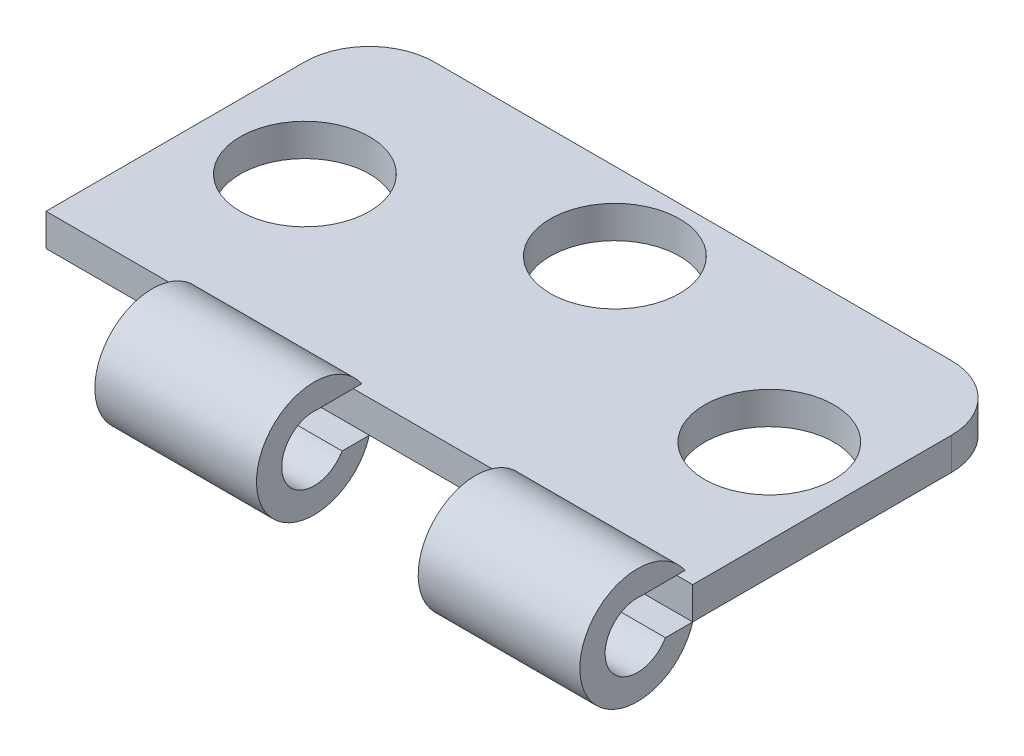
ISO-10303-21;
HEADER;
FILE_DESCRIPTION(('STEP AP214'),'2;1');
FILE_NAME('part.step','',(''),(''),'','','');
FILE_SCHEMA(('AUTOMOTIVE_DESIGN { 1 0 10303 214 1 1 1 1 }'));
ENDSEC;
DATA;
#1=APPLICATION_CONTEXT('core data for automotive mechanical design processes');
#2=APPLICATION_PROTOCOL_DEFINITION('international standard','automotive_design',2000,#1);
#3=PRODUCT_CONTEXT('',#1,'mechanical');
#4=PRODUCT('Part','Part','',(#3));
#5=PRODUCT_RELATED_PRODUCT_CATEGORY('part','',(#4));
#6=PRODUCT_DEFINITION_FORMATION('','',#4);
#7=PRODUCT_DEFINITION_CONTEXT('part definition',#1,'design');
#8=PRODUCT_DEFINITION('design','',#6,#7);
#9=PRODUCT_DEFINITION_SHAPE('','',#8);
#10=(LENGTH_UNIT() NAMED_UNIT(*) SI_UNIT(.MILLI.,.METRE.));
#11=(NAMED_UNIT(*) PLANE_ANGLE_UNIT() SI_UNIT($,.RADIAN.));
#12=(NAMED_UNIT(*) SI_UNIT($,.STERADIAN.) SOLID_ANGLE_UNIT());
#13=UNCERTAINTY_MEASURE_WITH_UNIT(LENGTH_MEASURE(1.E-05),#10,'distance_accuracy_value','');
#14=(GEOMETRIC_REPRESENTATION_CONTEXT(3) GLOBAL_UNCERTAINTY_ASSIGNED_CONTEXT((#13)) GLOBAL_UNIT_ASSIGNED_CONTEXT((#10,
#11,#12)) REPRESENTATION_CONTEXT('',''));
#15=CARTESIAN_POINT('',(0.,0.,0.));
#16=DIRECTION('',(0.,0.,1.));
#17=DIRECTION('',(1.,0.,0.));
#18=AXIS2_PLACEMENT_3D('',#15,#16,#17);
#19=CARTESIAN_POINT('',(-50.,15.2059594320731,0.0627148784948373));
#20=DIRECTION('',(0.,0.999991494928301,0.00412432674047643));
#21=DIRECTION('',(0.,-0.00412432674047643,0.999991494928301));
#22=AXIS2_PLACEMENT_3D('',#19,#20,#21);
#23=PLANE('',#22);
#24=DIRECTION('',(0.,-0.00412432674047643,0.999991494928301));
#25=VECTOR('',#24,1.);
#26=CARTESIAN_POINT('',(0.,15.2059594320731,0.0627148784948373));
#27=LINE('',#26,#25);
#28=CARTESIAN_POINT('',(0.,14.9903091140436,52.3496692052959));
#29=VERTEX_POINT('',#28);
#30=CARTESIAN_POINT('',(0.,14.9342237355402,65.9482284423281));
#31=VERTEX_POINT('',#30);
#32=EDGE_CURVE('E116',#29,#31,#27,.T.);
#33=ORIENTED_EDGE('',*,*,#32,.T.);
#34=DIRECTION('',(1.,0.,0.));
#35=VECTOR('',#34,1.);
#36=CARTESIAN_POINT('',(-50.,14.9342237355402,65.9482284423281));
#37=LINE('',#36,#35);
#38=CARTESIAN_POINT('',(-50.,14.9342237355402,65.9482284423281));
#39=VERTEX_POINT('',#38);
#40=EDGE_CURVE('E12',#39,#31,#37,.T.);
#41=ORIENTED_EDGE('',*,*,#40,.F.);
#42=DIRECTION('',(0.,-0.00412432674047643,0.999991494928301));
#43=VECTOR('',#42,1.);
#44=CARTESIAN_POINT('',(-50.,15.2059594320731,0.0627148784948373));
#45=LINE('',#44,#43);
#46=CARTESIAN_POINT('',(-50.,14.9903091140436,52.3496692052959));
#47=VERTEX_POINT('',#46);
#48=EDGE_CURVE('E111',#47,#39,#45,.T.);
#49=ORIENTED_EDGE('',*,*,#48,.F.);
#50=DIRECTION('',(1.,0.,0.));
#51=VECTOR('',#50,1.);
#52=CARTESIAN_POINT('',(-50.,14.9903091140436,52.3496692052959));
#53=LINE('',#52,#51);
#54=EDGE_CURVE('E55',#47,#29,#53,.T.);
#55=ORIENTED_EDGE('',*,*,#54,.T.);
#56=EDGE_LOOP('',(#33,#41,#49,#55));
#57=FACE_BOUND('',#56,.T.);
#58=ADVANCED_FACE('F52',(#57),#23,.F.);
#59=CARTESIAN_POINT('',(-50.,5.,67.0933043228832));
#60=DIRECTION('',(1.,0.,0.));
#61=DIRECTION('',(0.,0.,-1.));
#62=AXIS2_PLACEMENT_3D('',#59,#60,#61);
#63=CYLINDRICAL_SURFACE('',#62,10.);
#64=CARTESIAN_POINT('',(0.,5.,67.0933043228832));
#65=DIRECTION('',(1.,0.,0.));
#66=DIRECTION('',(0.,0.,-1.));
#67=AXIS2_PLACEMENT_3D('',#64,#65,#66);
#68=CIRCLE('',#67,10.);
#69=CARTESIAN_POINT('',(0.,0.,58.4330502850388));
#70=VERTEX_POINT('',#69);
#71=EDGE_CURVE('E91',#31,#70,#68,.T.);
#72=ORIENTED_EDGE('',*,*,#71,.T.);
#73=DIRECTION('',(1.,0.,0.));
#74=VECTOR('',#73,1.);
#75=CARTESIAN_POINT('',(-50.,0.,58.4330502850388));
#76=LINE('',#75,#74);
#77=CARTESIAN_POINT('',(-50.,0.,58.4330502850388));
#78=VERTEX_POINT('',#77);
#79=EDGE_CURVE('E61',#78,#70,#76,.T.);
#80=ORIENTED_EDGE('',*,*,#79,.F.);
#81=CARTESIAN_POINT('',(-50.,5.,67.0933043228832));
#82=DIRECTION('',(1.,0.,0.));
#83=DIRECTION('',(0.,0.,-1.));
#84=AXIS2_PLACEMENT_3D('',#81,#82,#83);
#85=CIRCLE('',#84,10.);
#86=EDGE_CURVE('E69',#39,#78,#85,.T.);
#87=ORIENTED_EDGE('',*,*,#86,.F.);
#88=ORIENTED_EDGE('',*,*,#40,.T.);
#89=EDGE_LOOP('',(#72,#80,#87,#88));
#90=FACE_BOUND('',#89,.T.);
#91=ADVANCED_FACE('F123',(#90),#63,.F.);
#92=CARTESIAN_POINT('',(-50.,0.,0.));
#93=DIRECTION('',(0.,1.,0.));
#94=DIRECTION('',(0.,0.,1.));
#95=AXIS2_PLACEMENT_3D('',#92,#93,#94);
#96=PLANE('',#95);
#97=DIRECTION('',(0.,0.,1.));
#98=VECTOR('',#97,1.);
#99=CARTESIAN_POINT('',(0.,0.,0.));
#100=LINE('',#99,#98);
#101=CARTESIAN_POINT('',(0.,0.,50.));
#102=VERTEX_POINT('',#101);
#103=EDGE_CURVE('E103',#102,#70,#100,.T.);
#104=ORIENTED_EDGE('',*,*,#103,.F.);
#105=DIRECTION('',(1.,0.,0.));
#106=VECTOR('',#105,1.);
#107=CARTESIAN_POINT('',(-50.,0.,50.));
#108=LINE('',#107,#106);
#109=CARTESIAN_POINT('',(-50.,0.,50.));
#110=VERTEX_POINT('',#109);
#111=EDGE_CURVE('E99',#110,#102,#108,.T.);
#112=ORIENTED_EDGE('',*,*,#111,.F.);
#113=DIRECTION('',(0.,0.,1.));
#114=VECTOR('',#113,1.);
#115=CARTESIAN_POINT('',(-50.,0.,0.));
#116=LINE('',#115,#114);
#117=EDGE_CURVE('E102',#110,#78,#116,.T.);
#118=ORIENTED_EDGE('',*,*,#117,.T.);
#119=ORIENTED_EDGE('',*,*,#79,.T.);
#120=EDGE_LOOP('',(#104,#112,#118,#119));
#121=FACE_BOUND('',#120,.T.);
#122=ADVANCED_FACE('F101',(#121),#96,.T.);
#123=CARTESIAN_POINT('',(-50.,5.,67.0933043228832));
#124=DIRECTION('',(1.,0.,0.));
#125=DIRECTION('',(0.,0.,-1.));
#126=AXIS2_PLACEMENT_3D('',#123,#124,#125);
#127=CYLINDRICAL_SURFACE('',#126,17.8095775546389);
#128=CARTESIAN_POINT('',(0.,5.,67.0933043228832));
#129=DIRECTION('',(1.,0.,0.));
#130=DIRECTION('',(0.,0.,-1.));
#131=AXIS2_PLACEMENT_3D('',#128,#129,#130);
#132=CIRCLE('',#131,17.8095775546389);
#133=EDGE_CURVE('E119',#29,#102,#132,.T.);
#134=ORIENTED_EDGE('',*,*,#133,.F.);
#135=ORIENTED_EDGE('',*,*,#54,.F.);
#136=CARTESIAN_POINT('',(-50.,5.,67.0933043228832));
#137=DIRECTION('',(1.,0.,0.));
#138=DIRECTION('',(0.,0.,-1.));
#139=AXIS2_PLACEMENT_3D('',#136,#137,#138);
#140=CIRCLE('',#139,17.8095775546389);
#141=EDGE_CURVE('E108',#47,#110,#140,.T.);
#142=ORIENTED_EDGE('',*,*,#141,.T.);
#143=ORIENTED_EDGE('',*,*,#111,.T.);
#144=EDGE_LOOP('',(#134,#135,#142,#143));
#145=FACE_BOUND('',#144,.T.);
#146=ADVANCED_FACE('F110',(#145),#127,.T.);
#147=CARTESIAN_POINT('',(-50.,0.,0.));
#148=DIRECTION('',(1.,0.,0.));
#149=DIRECTION('',(0.,0.,-1.));
#150=AXIS2_PLACEMENT_3D('',#147,#148,#149);
#151=PLANE('',#150);
#152=ORIENTED_EDGE('',*,*,#48,.T.);
#153=ORIENTED_EDGE('',*,*,#86,.T.);
#154=ORIENTED_EDGE('',*,*,#117,.F.);
#155=ORIENTED_EDGE('',*,*,#141,.F.);
#156=EDGE_LOOP('',(#152,#153,#154,#155));
#157=FACE_BOUND('',#156,.T.);
#158=ADVANCED_FACE('F107',(#157),#151,.F.);
#159=CARTESIAN_POINT('',(0.,0.,0.));
#160=DIRECTION('',(1.,0.,0.));
#161=DIRECTION('',(0.,0.,-1.));
#162=AXIS2_PLACEMENT_3D('',#159,#160,#161);
#163=PLANE('',#162);
#164=ORIENTED_EDGE('',*,*,#32,.F.);
#165=ORIENTED_EDGE('',*,*,#133,.T.);
#166=ORIENTED_EDGE('',*,*,#103,.T.);
#167=ORIENTED_EDGE('',*,*,#71,.F.);
#168=EDGE_LOOP('',(#164,#165,#166,#167));
#169=FACE_BOUND('',#168,.T.);
#170=ADVANCED_FACE('F125',(#169),#163,.T.);
#171=CLOSED_SHELL('',(#58,#91,#122,#146,#158,#170));
#172=MANIFOLD_SOLID_BREP('B2',#171);
#173=CARTESIAN_POINT('',(50.,15.2059594320731,0.0627148784948373));
#174=DIRECTION('',(0.,0.999991494928301,0.00412432674047643));
#175=DIRECTION('',(0.,-0.00412432674047643,0.999991494928301));
#176=AXIS2_PLACEMENT_3D('',#173,#174,#175);
#177=PLANE('',#176);
#178=DIRECTION('',(0.,-0.00412432674047643,0.999991494928301));
#179=VECTOR('',#178,1.);
#180=CARTESIAN_POINT('',(100.,15.2059594320731,0.0627148784948373));
#181=LINE('',#180,#179);
#182=CARTESIAN_POINT('',(100.,14.9903091140436,52.3496692052959));
#183=VERTEX_POINT('',#182);
#184=CARTESIAN_POINT('',(100.,14.9342237355402,65.9482284423281));
#185=VERTEX_POINT('',#184);
#186=EDGE_CURVE('E249',#183,#185,#181,.T.);
#187=ORIENTED_EDGE('',*,*,#186,.T.);
#188=DIRECTION('',(1.,0.,0.));
#189=VECTOR('',#188,1.);
#190=CARTESIAN_POINT('',(50.,14.9342237355402,65.9482284423281));
#191=LINE('',#190,#189);
#192=CARTESIAN_POINT('',(50.,14.9342237355402,65.9482284423281));
#193=VERTEX_POINT('',#192);
#194=EDGE_CURVE('E50',#193,#185,#191,.T.);
#195=ORIENTED_EDGE('',*,*,#194,.F.);
#196=DIRECTION('',(0.,-0.00412432674047643,0.999991494928301));
#197=VECTOR('',#196,1.);
#198=CARTESIAN_POINT('',(50.,15.2059594320731,0.0627148784948373));
#199=LINE('',#198,#197);
#200=CARTESIAN_POINT('',(50.,14.9903091140436,52.3496692052959));
#201=VERTEX_POINT('',#200);
#202=EDGE_CURVE('E244',#201,#193,#199,.T.);
#203=ORIENTED_EDGE('',*,*,#202,.F.);
#204=DIRECTION('',(1.,0.,0.));
#205=VECTOR('',#204,1.);
#206=CARTESIAN_POINT('',(50.,14.9903091140436,52.3496692052959));
#207=LINE('',#206,#205);
#208=EDGE_CURVE('E188',#201,#183,#207,.T.);
#209=ORIENTED_EDGE('',*,*,#208,.T.);
#210=EDGE_LOOP('',(#187,#195,#203,#209));
#211=FACE_BOUND('',#210,.T.);
#212=ADVANCED_FACE('F185',(#211),#177,.F.);
#213=CARTESIAN_POINT('',(50.,5.,67.0933043228832));
#214=DIRECTION('',(1.,0.,0.));
#215=DIRECTION('',(0.,0.,-1.));
#216=AXIS2_PLACEMENT_3D('',#213,#214,#215);
#217=CYLINDRICAL_SURFACE('',#216,10.);
#218=CARTESIAN_POINT('',(100.,5.,67.0933043228832));
#219=DIRECTION('',(1.,0.,0.));
#220=DIRECTION('',(0.,0.,-1.));
#221=AXIS2_PLACEMENT_3D('',#218,#219,#220);
#222=CIRCLE('',#221,10.);
#223=CARTESIAN_POINT('',(100.,0.,58.4330502850388));
#224=VERTEX_POINT('',#223);
#225=EDGE_CURVE('E224',#185,#224,#222,.T.);
#226=ORIENTED_EDGE('',*,*,#225,.T.);
#227=DIRECTION('',(1.,0.,0.));
#228=VECTOR('',#227,1.);
#229=CARTESIAN_POINT('',(50.,0.,58.4330502850388));
#230=LINE('',#229,#228);
#231=CARTESIAN_POINT('',(50.,0.,58.4330502850388));
#232=VERTEX_POINT('',#231);
#233=EDGE_CURVE('E194',#232,#224,#230,.T.);
#234=ORIENTED_EDGE('',*,*,#233,.F.);
#235=CARTESIAN_POINT('',(50.,5.,67.0933043228832));
#236=DIRECTION('',(1.,0.,0.));
#237=DIRECTION('',(0.,0.,-1.));
#238=AXIS2_PLACEMENT_3D('',#235,#236,#237);
#239=CIRCLE('',#238,10.);
#240=EDGE_CURVE('E202',#193,#232,#239,.T.);
#241=ORIENTED_EDGE('',*,*,#240,.F.);
#242=ORIENTED_EDGE('',*,*,#194,.T.);
#243=EDGE_LOOP('',(#226,#234,#241,#242));
#244=FACE_BOUND('',#243,.T.);
#245=ADVANCED_FACE('F256',(#244),#217,.F.);
#246=CARTESIAN_POINT('',(50.,0.,0.));
#247=DIRECTION('',(0.,1.,0.));
#248=DIRECTION('',(0.,0.,1.));
#249=AXIS2_PLACEMENT_3D('',#246,#247,#248);
#250=PLANE('',#249);
#251=DIRECTION('',(0.,0.,1.));
#252=VECTOR('',#251,1.);
#253=CARTESIAN_POINT('',(100.,0.,0.));
#254=LINE('',#253,#252);
#255=CARTESIAN_POINT('',(100.,0.,50.));
#256=VERTEX_POINT('',#255);
#257=EDGE_CURVE('E236',#256,#224,#254,.T.);
#258=ORIENTED_EDGE('',*,*,#257,.F.);
#259=DIRECTION('',(1.,0.,0.));
#260=VECTOR('',#259,1.);
#261=CARTESIAN_POINT('',(50.,0.,50.));
#262=LINE('',#261,#260);
#263=CARTESIAN_POINT('',(50.,0.,50.));
#264=VERTEX_POINT('',#263);
#265=EDGE_CURVE('E232',#264,#256,#262,.T.);
#266=ORIENTED_EDGE('',*,*,#265,.F.);
#267=DIRECTION('',(0.,0.,1.));
#268=VECTOR('',#267,1.);
#269=CARTESIAN_POINT('',(50.,0.,0.));
#270=LINE('',#269,#268);
#271=EDGE_CURVE('E235',#264,#232,#270,.T.);
#272=ORIENTED_EDGE('',*,*,#271,.T.);
#273=ORIENTED_EDGE('',*,*,#233,.T.);
#274=EDGE_LOOP('',(#258,#266,#272,#273));
#275=FACE_BOUND('',#274,.T.);
#276=ADVANCED_FACE('F234',(#275),#250,.T.);
#277=CARTESIAN_POINT('',(50.,5.,67.0933043228832));
#278=DIRECTION('',(1.,0.,0.));
#279=DIRECTION('',(0.,0.,-1.));
#280=AXIS2_PLACEMENT_3D('',#277,#278,#279);
#281=CYLINDRICAL_SURFACE('',#280,17.8095775546389);
#282=CARTESIAN_POINT('',(100.,5.,67.0933043228832));
#283=DIRECTION('',(1.,0.,0.));
#284=DIRECTION('',(0.,0.,-1.));
#285=AXIS2_PLACEMENT_3D('',#282,#283,#284);
#286=CIRCLE('',#285,17.8095775546389);
#287=EDGE_CURVE('E252',#183,#256,#286,.T.);
#288=ORIENTED_EDGE('',*,*,#287,.F.);
#289=ORIENTED_EDGE('',*,*,#208,.F.);
#290=CARTESIAN_POINT('',(50.,5.,67.0933043228832));
#291=DIRECTION('',(1.,0.,0.));
#292=DIRECTION('',(0.,0.,-1.));
#293=AXIS2_PLACEMENT_3D('',#290,#291,#292);
#294=CIRCLE('',#293,17.8095775546389);
#295=EDGE_CURVE('E241',#201,#264,#294,.T.);
#296=ORIENTED_EDGE('',*,*,#295,.T.);
#297=ORIENTED_EDGE('',*,*,#265,.T.);
#298=EDGE_LOOP('',(#288,#289,#296,#297));
#299=FACE_BOUND('',#298,.T.);
#300=ADVANCED_FACE('F243',(#299),#281,.T.);
#301=CARTESIAN_POINT('',(50.,0.,0.));
#302=DIRECTION('',(1.,0.,0.));
#303=DIRECTION('',(0.,0.,-1.));
#304=AXIS2_PLACEMENT_3D('',#301,#302,#303);
#305=PLANE('',#304);
#306=ORIENTED_EDGE('',*,*,#202,.T.);
#307=ORIENTED_EDGE('',*,*,#240,.T.);
#308=ORIENTED_EDGE('',*,*,#271,.F.);
#309=ORIENTED_EDGE('',*,*,#295,.F.);
#310=EDGE_LOOP('',(#306,#307,#308,#309));
#311=FACE_BOUND('',#310,.T.);
#312=ADVANCED_FACE('F240',(#311),#305,.F.);
#313=CARTESIAN_POINT('',(100.,0.,0.));
#314=DIRECTION('',(1.,0.,0.));
#315=DIRECTION('',(0.,0.,-1.));
#316=AXIS2_PLACEMENT_3D('',#313,#314,#315);
#317=PLANE('',#316);
#318=ORIENTED_EDGE('',*,*,#186,.F.);
#319=ORIENTED_EDGE('',*,*,#287,.T.);
#320=ORIENTED_EDGE('',*,*,#257,.T.);
#321=ORIENTED_EDGE('',*,*,#225,.F.);
#322=EDGE_LOOP('',(#318,#319,#320,#321));
#323=FACE_BOUND('',#322,.T.);
#324=ADVANCED_FACE('F258',(#323),#317,.T.);
#325=CLOSED_SHELL('',(#212,#245,#276,#300,#312,#324));
#326=MANIFOLD_SOLID_BREP('B6',#325);
#327=CARTESIAN_POINT('',(-80.,10.,-30.));
#328=DIRECTION('',(0.,1.,0.));
#329=DIRECTION('',(0.,0.,1.));
#330=AXIS2_PLACEMENT_3D('',#327,#328,#329);
#331=PLANE('',#330);
#332=CARTESIAN_POINT('',(73.6842105263157,10.,0.));
#333=DIRECTION('',(0.,1.,0.));
#334=DIRECTION('',(0.,0.,1.));
#335=AXIS2_PLACEMENT_3D('',#332,#333,#334);
#336=CIRCLE('',#335,20.);
#337=CARTESIAN_POINT('',(73.6842105263157,10.,20.));
#338=VERTEX_POINT('',#337);
#339=EDGE_CURVE('E477',#338,#338,#336,.T.);
#340=ORIENTED_EDGE('',*,*,#339,.F.);
#341=EDGE_LOOP('',(#340));
#342=FACE_BOUND('',#341,.T.);
#343=DIRECTION('',(0.,0.,1.));
#344=VECTOR('',#343,1.);
#345=CARTESIAN_POINT('',(-100.,10.,50.));
#346=LINE('',#345,#344);
#347=CARTESIAN_POINT('',(-100.,10.,-29.9999999999999));
#348=VERTEX_POINT('',#347);
#349=CARTESIAN_POINT('',(-100.,10.,50.));
#350=VERTEX_POINT('',#349);
#351=EDGE_CURVE('E416',#348,#350,#346,.T.);
#352=ORIENTED_EDGE('',*,*,#351,.T.);
#353=DIRECTION('',(1.,0.,0.));
#354=VECTOR('',#353,1.);
#355=CARTESIAN_POINT('',(-100.,10.,50.));
#356=LINE('',#355,#354);
#357=CARTESIAN_POINT('',(100.,10.,50.));
#358=VERTEX_POINT('',#357);
#359=EDGE_CURVE('E364',#350,#358,#356,.T.);
#360=ORIENTED_EDGE('',*,*,#359,.T.);
#361=DIRECTION('',(0.,0.,-1.));
#362=VECTOR('',#361,1.);
#363=CARTESIAN_POINT('',(100.,10.,50.));
#364=LINE('',#363,#362);
#365=CARTESIAN_POINT('',(100.,10.,-29.9999999999999));
#366=VERTEX_POINT('',#365);
#367=EDGE_CURVE('E377',#358,#366,#364,.T.);
#368=ORIENTED_EDGE('',*,*,#367,.T.);
#369=CARTESIAN_POINT('',(80.,10.,-30.));
#370=DIRECTION('',(0.,1.,0.));
#371=DIRECTION('',(0.,0.,1.));
#372=AXIS2_PLACEMENT_3D('',#369,#370,#371);
#373=CIRCLE('',#372,20.);
#374=CARTESIAN_POINT('',(79.9999999999999,10.,-50.));
#375=VERTEX_POINT('',#374);
#376=EDGE_CURVE('E371',#366,#375,#373,.T.);
#377=ORIENTED_EDGE('',*,*,#376,.T.);
#378=DIRECTION('',(-1.,0.,0.));
#379=VECTOR('',#378,1.);
#380=CARTESIAN_POINT('',(-79.9999999999998,10.,-50.));
#381=LINE('',#380,#379);
#382=CARTESIAN_POINT('',(-79.9999999999998,10.,-50.));
#383=VERTEX_POINT('',#382);
#384=EDGE_CURVE('E375',#375,#383,#381,.T.);
#385=ORIENTED_EDGE('',*,*,#384,.T.);
#386=CARTESIAN_POINT('',(-80.,10.,-30.));
#387=DIRECTION('',(0.,1.,0.));
#388=DIRECTION('',(0.,0.,1.));
#389=AXIS2_PLACEMENT_3D('',#386,#387,#388);
#390=CIRCLE('',#389,20.);
#391=EDGE_CURVE('E327',#383,#348,#390,.T.);
#392=ORIENTED_EDGE('',*,*,#391,.T.);
#393=EDGE_LOOP('',(#352,#360,#368,#377,#385,#392));
#394=FACE_BOUND('',#393,.T.);
#395=CARTESIAN_POINT('',(0.,10.,-25.9398496240602));
#396=DIRECTION('',(0.,1.,0.));
#397=DIRECTION('',(0.,0.,1.));
#398=AXIS2_PLACEMENT_3D('',#395,#396,#397);
#399=CIRCLE('',#398,20.);
#400=CARTESIAN_POINT('',(0.,10.,-5.93984962406015));
#401=VERTEX_POINT('',#400);
#402=EDGE_CURVE('E404',#401,#401,#399,.T.);
#403=ORIENTED_EDGE('',*,*,#402,.F.);
#404=EDGE_LOOP('',(#403));
#405=FACE_BOUND('',#404,.T.);
#406=CARTESIAN_POINT('',(-69.9248120300752,10.,0.));
#407=DIRECTION('',(0.,1.,0.));
#408=DIRECTION('',(0.,0.,1.));
#409=AXIS2_PLACEMENT_3D('',#406,#407,#408);
#410=CIRCLE('',#409,20.);
#411=CARTESIAN_POINT('',(-69.9248120300752,10.,20.));
#412=VERTEX_POINT('',#411);
#413=EDGE_CURVE('E466',#412,#412,#410,.T.);
#414=ORIENTED_EDGE('',*,*,#413,.F.);
#415=EDGE_LOOP('',(#414));
#416=FACE_BOUND('',#415,.T.);
#417=ADVANCED_FACE('F309',(#342,#394,#405,#416),#331,.T.);
#418=CARTESIAN_POINT('',(-80.,0.,-30.));
#419=DIRECTION('',(0.,1.,0.));
#420=DIRECTION('',(0.,0.,1.));
#421=AXIS2_PLACEMENT_3D('',#418,#419,#420);
#422=PLANE('',#421);
#423=DIRECTION('',(0.,0.,1.));
#424=VECTOR('',#423,1.);
#425=CARTESIAN_POINT('',(-100.,0.,50.));
#426=LINE('',#425,#424);
#427=CARTESIAN_POINT('',(-100.,0.,-29.9999999999999));
#428=VERTEX_POINT('',#427);
#429=CARTESIAN_POINT('',(-100.,0.,50.));
#430=VERTEX_POINT('',#429);
#431=EDGE_CURVE('E399',#428,#430,#426,.T.);
#432=ORIENTED_EDGE('',*,*,#431,.F.);
#433=CARTESIAN_POINT('',(-80.,0.,-30.));
#434=DIRECTION('',(0.,1.,0.));
#435=DIRECTION('',(0.,0.,1.));
#436=AXIS2_PLACEMENT_3D('',#433,#434,#435);
#437=CIRCLE('',#436,20.);
#438=CARTESIAN_POINT('',(-79.9999999999998,0.,-50.));
#439=VERTEX_POINT('',#438);
#440=EDGE_CURVE('E356',#439,#428,#437,.T.);
#441=ORIENTED_EDGE('',*,*,#440,.F.);
#442=DIRECTION('',(-1.,0.,0.));
#443=VECTOR('',#442,1.);
#444=CARTESIAN_POINT('',(-79.9999999999998,0.,-50.));
#445=LINE('',#444,#443);
#446=CARTESIAN_POINT('',(79.9999999999999,0.,-50.));
#447=VERTEX_POINT('',#446);
#448=EDGE_CURVE('E350',#447,#439,#445,.T.);
#449=ORIENTED_EDGE('',*,*,#448,.F.);
#450=CARTESIAN_POINT('',(80.,0.,-30.));
#451=DIRECTION('',(0.,1.,0.));
#452=DIRECTION('',(0.,0.,1.));
#453=AXIS2_PLACEMENT_3D('',#450,#451,#452);
#454=CIRCLE('',#453,20.);
#455=CARTESIAN_POINT('',(100.,0.,-29.9999999999999));
#456=VERTEX_POINT('',#455);
#457=EDGE_CURVE('E386',#456,#447,#454,.T.);
#458=ORIENTED_EDGE('',*,*,#457,.F.);
#459=DIRECTION('',(0.,0.,-1.));
#460=VECTOR('',#459,1.);
#461=CARTESIAN_POINT('',(100.,0.,50.));
#462=LINE('',#461,#460);
#463=CARTESIAN_POINT('',(100.,0.,50.));
#464=VERTEX_POINT('',#463);
#465=EDGE_CURVE('E407',#464,#456,#462,.T.);
#466=ORIENTED_EDGE('',*,*,#465,.F.);
#467=DIRECTION('',(1.,0.,0.));
#468=VECTOR('',#467,1.);
#469=CARTESIAN_POINT('',(-100.,0.,50.));
#470=LINE('',#469,#468);
#471=EDGE_CURVE('E403',#430,#464,#470,.T.);
#472=ORIENTED_EDGE('',*,*,#471,.F.);
#473=EDGE_LOOP('',(#432,#441,#449,#458,#466,#472));
#474=FACE_BOUND('',#473,.T.);
#475=CARTESIAN_POINT('',(0.,0.,-25.9398496240602));
#476=DIRECTION('',(0.,1.,0.));
#477=DIRECTION('',(0.,0.,1.));
#478=AXIS2_PLACEMENT_3D('',#475,#476,#477);
#479=CIRCLE('',#478,20.);
#480=CARTESIAN_POINT('',(0.,0.,-5.93984962406015));
#481=VERTEX_POINT('',#480);
#482=EDGE_CURVE('E481',#481,#481,#479,.T.);
#483=ORIENTED_EDGE('',*,*,#482,.T.);
#484=EDGE_LOOP('',(#483));
#485=FACE_BOUND('',#484,.T.);
#486=CARTESIAN_POINT('',(73.6842105263157,0.,0.));
#487=DIRECTION('',(0.,1.,0.));
#488=DIRECTION('',(0.,0.,1.));
#489=AXIS2_PLACEMENT_3D('',#486,#487,#488);
#490=CIRCLE('',#489,20.);
#491=CARTESIAN_POINT('',(73.6842105263157,0.,20.));
#492=VERTEX_POINT('',#491);
#493=EDGE_CURVE('E474',#492,#492,#490,.T.);
#494=ORIENTED_EDGE('',*,*,#493,.T.);
#495=EDGE_LOOP('',(#494));
#496=FACE_BOUND('',#495,.T.);
#497=CARTESIAN_POINT('',(-69.9248120300752,0.,0.));
#498=DIRECTION('',(0.,1.,0.));
#499=DIRECTION('',(0.,0.,1.));
#500=AXIS2_PLACEMENT_3D('',#497,#498,#499);
#501=CIRCLE('',#500,20.);
#502=CARTESIAN_POINT('',(-69.9248120300752,0.,20.));
#503=VERTEX_POINT('',#502);
#504=EDGE_CURVE('E469',#503,#503,#501,.T.);
#505=ORIENTED_EDGE('',*,*,#504,.T.);
#506=EDGE_LOOP('',(#505));
#507=FACE_BOUND('',#506,.T.);
#508=ADVANCED_FACE('F429',(#474,#485,#496,#507),#422,.F.);
#509=CARTESIAN_POINT('',(-100.,10.,50.));
#510=DIRECTION('',(1.,0.,0.));
#511=DIRECTION('',(0.,0.,-1.));
#512=AXIS2_PLACEMENT_3D('',#509,#510,#511);
#513=PLANE('',#512);
#514=ORIENTED_EDGE('',*,*,#431,.T.);
#515=DIRECTION('',(0.,-1.,0.));
#516=VECTOR('',#515,1.);
#517=CARTESIAN_POINT('',(-100.,10.,50.));
#518=LINE('',#517,#516);
#519=EDGE_CURVE('E183',#350,#430,#518,.T.);
#520=ORIENTED_EDGE('',*,*,#519,.F.);
#521=ORIENTED_EDGE('',*,*,#351,.F.);
#522=DIRECTION('',(0.,-1.,0.));
#523=VECTOR('',#522,1.);
#524=CARTESIAN_POINT('',(-100.,10.,-29.9999999999999));
#525=LINE('',#524,#523);
#526=EDGE_CURVE('E395',#348,#428,#525,.T.);
#527=ORIENTED_EDGE('',*,*,#526,.T.);
#528=EDGE_LOOP('',(#514,#520,#521,#527));
#529=FACE_BOUND('',#528,.T.);
#530=ADVANCED_FACE('F311',(#529),#513,.F.);
#531=CARTESIAN_POINT('',(-100.,10.,50.));
#532=DIRECTION('',(0.,0.,-1.));
#533=DIRECTION('',(-1.,0.,0.));
#534=AXIS2_PLACEMENT_3D('',#531,#532,#533);
#535=PLANE('',#534);
#536=ORIENTED_EDGE('',*,*,#471,.T.);
#537=DIRECTION('',(0.,-1.,0.));
#538=VECTOR('',#537,1.);
#539=CARTESIAN_POINT('',(100.,10.,50.));
#540=LINE('',#539,#538);
#541=EDGE_CURVE('E319',#358,#464,#540,.T.);
#542=ORIENTED_EDGE('',*,*,#541,.F.);
#543=ORIENTED_EDGE('',*,*,#359,.F.);
#544=ORIENTED_EDGE('',*,*,#519,.T.);
#545=EDGE_LOOP('',(#536,#542,#543,#544));
#546=FACE_BOUND('',#545,.T.);
#547=ADVANCED_FACE('F537',(#546),#535,.F.);
#548=CARTESIAN_POINT('',(100.,10.,50.));
#549=DIRECTION('',(-1.,0.,0.));
#550=DIRECTION('',(0.,0.,1.));
#551=AXIS2_PLACEMENT_3D('',#548,#549,#550);
#552=PLANE('',#551);
#553=ORIENTED_EDGE('',*,*,#465,.T.);
#554=DIRECTION('',(0.,-1.,0.));
#555=VECTOR('',#554,1.);
#556=CARTESIAN_POINT('',(100.,10.,-29.9999999999999));
#557=LINE('',#556,#555);
#558=EDGE_CURVE('E388',#366,#456,#557,.T.);
#559=ORIENTED_EDGE('',*,*,#558,.F.);
#560=ORIENTED_EDGE('',*,*,#367,.F.);
#561=ORIENTED_EDGE('',*,*,#541,.T.);
#562=EDGE_LOOP('',(#553,#559,#560,#561));
#563=FACE_BOUND('',#562,.T.);
#564=ADVANCED_FACE('F426',(#563),#552,.F.);
#565=CARTESIAN_POINT('',(80.,10.,-30.));
#566=DIRECTION('',(0.,-1.,0.));
#567=DIRECTION('',(0.,0.,-1.));
#568=AXIS2_PLACEMENT_3D('',#565,#566,#567);
#569=CYLINDRICAL_SURFACE('',#568,20.);
#570=ORIENTED_EDGE('',*,*,#457,.T.);
#571=DIRECTION('',(0.,-1.,0.));
#572=VECTOR('',#571,1.);
#573=CARTESIAN_POINT('',(79.9999999999999,10.,-50.));
#574=LINE('',#573,#572);
#575=EDGE_CURVE('E383',#375,#447,#574,.T.);
#576=ORIENTED_EDGE('',*,*,#575,.F.);
#577=ORIENTED_EDGE('',*,*,#376,.F.);
#578=ORIENTED_EDGE('',*,*,#558,.T.);
#579=EDGE_LOOP('',(#570,#576,#577,#578));
#580=FACE_BOUND('',#579,.T.);
#581=ADVANCED_FACE('F384',(#580),#569,.T.);
#582=CARTESIAN_POINT('',(-79.9999999999998,10.,-50.));
#583=DIRECTION('',(0.,0.,1.));
#584=DIRECTION('',(1.,0.,0.));
#585=AXIS2_PLACEMENT_3D('',#582,#583,#584);
#586=PLANE('',#585);
#587=ORIENTED_EDGE('',*,*,#448,.T.);
#588=DIRECTION('',(0.,-1.,0.));
#589=VECTOR('',#588,1.);
#590=CARTESIAN_POINT('',(-79.9999999999998,10.,-50.));
#591=LINE('',#590,#589);
#592=EDGE_CURVE('E389',#383,#439,#591,.T.);
#593=ORIENTED_EDGE('',*,*,#592,.F.);
#594=ORIENTED_EDGE('',*,*,#384,.F.);
#595=ORIENTED_EDGE('',*,*,#575,.T.);
#596=EDGE_LOOP('',(#587,#593,#594,#595));
#597=FACE_BOUND('',#596,.T.);
#598=ADVANCED_FACE('F391',(#597),#586,.F.);
#599=CARTESIAN_POINT('',(-80.,10.,-30.));
#600=DIRECTION('',(0.,-1.,0.));
#601=DIRECTION('',(0.,0.,-1.));
#602=AXIS2_PLACEMENT_3D('',#599,#600,#601);
#603=CYLINDRICAL_SURFACE('',#602,20.);
#604=ORIENTED_EDGE('',*,*,#440,.T.);
#605=ORIENTED_EDGE('',*,*,#526,.F.);
#606=ORIENTED_EDGE('',*,*,#391,.F.);
#607=ORIENTED_EDGE('',*,*,#592,.T.);
#608=EDGE_LOOP('',(#604,#605,#606,#607));
#609=FACE_BOUND('',#608,.T.);
#610=ADVANCED_FACE('F434',(#609),#603,.T.);
#611=CARTESIAN_POINT('',(0.,10.,-25.9398496240602));
#612=DIRECTION('',(0.,-1.,0.));
#613=DIRECTION('',(0.,0.,-1.));
#614=AXIS2_PLACEMENT_3D('',#611,#612,#613);
#615=CYLINDRICAL_SURFACE('',#614,20.);
#616=ORIENTED_EDGE('',*,*,#402,.T.);
#617=EDGE_LOOP('',(#616));
#618=FACE_BOUND('',#617,.T.);
#619=ORIENTED_EDGE('',*,*,#482,.F.);
#620=EDGE_LOOP('',(#619));
#621=FACE_BOUND('',#620,.T.);
#622=ADVANCED_FACE('F436',(#618,#621),#615,.F.);
#623=CARTESIAN_POINT('',(73.6842105263157,10.,0.));
#624=DIRECTION('',(0.,-1.,0.));
#625=DIRECTION('',(0.,0.,-1.));
#626=AXIS2_PLACEMENT_3D('',#623,#624,#625);
#627=CYLINDRICAL_SURFACE('',#626,20.);
#628=ORIENTED_EDGE('',*,*,#339,.T.);
#629=EDGE_LOOP('',(#628));
#630=FACE_BOUND('',#629,.T.);
#631=ORIENTED_EDGE('',*,*,#493,.F.);
#632=EDGE_LOOP('',(#631));
#633=FACE_BOUND('',#632,.T.);
#634=ADVANCED_FACE('F442',(#630,#633),#627,.F.);
#635=CARTESIAN_POINT('',(-69.9248120300752,10.,0.));
#636=DIRECTION('',(0.,-1.,0.));
#637=DIRECTION('',(0.,0.,-1.));
#638=AXIS2_PLACEMENT_3D('',#635,#636,#637);
#639=CYLINDRICAL_SURFACE('',#638,20.);
#640=ORIENTED_EDGE('',*,*,#413,.T.);
#641=EDGE_LOOP('',(#640));
#642=FACE_BOUND('',#641,.T.);
#643=ORIENTED_EDGE('',*,*,#504,.F.);
#644=EDGE_LOOP('',(#643));
#645=FACE_BOUND('',#644,.T.);
#646=ADVANCED_FACE('F457',(#642,#645),#639,.F.);
#647=CLOSED_SHELL('',(#417,#508,#530,#547,#564,#581,#598,#610,#622,#634,#646));
#648=MANIFOLD_SOLID_BREP('B44',#647);
#649=ADVANCED_BREP_SHAPE_REPRESENTATION('',(#18,#172,#326,#648),#14);
#650=SHAPE_DEFINITION_REPRESENTATION(#9,#649);
ENDSEC;
END-ISO-10303-21;
